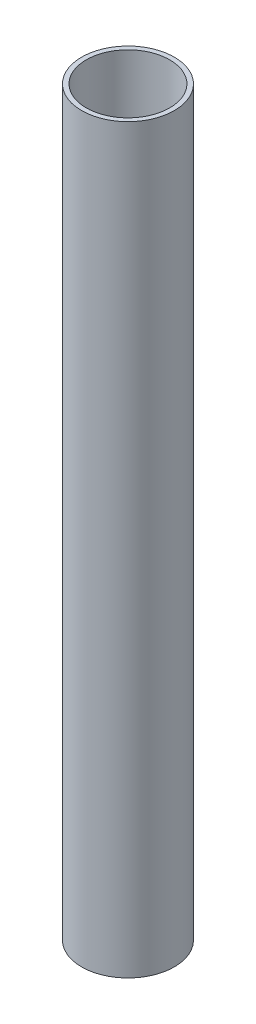
ISO-10303-21;
HEADER;
FILE_DESCRIPTION(('STEP AP214'),'2;1');
FILE_NAME('part.step','',(''),(''),'','','');
FILE_SCHEMA(('AUTOMOTIVE_DESIGN { 1 0 10303 214 1 1 1 1 }'));
ENDSEC;
DATA;
#1=APPLICATION_CONTEXT('core data for automotive mechanical design processes');
#2=APPLICATION_PROTOCOL_DEFINITION('international standard','automotive_design',2000,#1);
#3=PRODUCT_CONTEXT('',#1,'mechanical');
#4=PRODUCT('Part','Part','',(#3));
#5=PRODUCT_RELATED_PRODUCT_CATEGORY('part','',(#4));
#6=PRODUCT_DEFINITION_FORMATION('','',#4);
#7=PRODUCT_DEFINITION_CONTEXT('part definition',#1,'design');
#8=PRODUCT_DEFINITION('design','',#6,#7);
#9=PRODUCT_DEFINITION_SHAPE('','',#8);
#10=(LENGTH_UNIT() NAMED_UNIT(*) SI_UNIT(.MILLI.,.METRE.));
#11=(NAMED_UNIT(*) PLANE_ANGLE_UNIT() SI_UNIT($,.RADIAN.));
#12=(NAMED_UNIT(*) SI_UNIT($,.STERADIAN.) SOLID_ANGLE_UNIT());
#13=UNCERTAINTY_MEASURE_WITH_UNIT(LENGTH_MEASURE(1.E-05),#10,'distance_accuracy_value','');
#14=(GEOMETRIC_REPRESENTATION_CONTEXT(3) GLOBAL_UNCERTAINTY_ASSIGNED_CONTEXT((#13)) GLOBAL_UNIT_ASSIGNED_CONTEXT((#10,
#11,#12)) REPRESENTATION_CONTEXT('',''));
#15=CARTESIAN_POINT('',(0.,0.,0.));
#16=DIRECTION('',(0.,0.,1.));
#17=DIRECTION('',(1.,0.,0.));
#18=AXIS2_PLACEMENT_3D('',#15,#16,#17);
#19=CARTESIAN_POINT('',(0.,80.,0.));
#20=DIRECTION('',(0.,1.,0.));
#21=DIRECTION('',(0.,0.,1.));
#22=AXIS2_PLACEMENT_3D('',#19,#20,#21);
#23=PLANE('',#22);
#24=CARTESIAN_POINT('',(0.,80.,0.));
#25=DIRECTION('',(0.,1.,0.));
#26=DIRECTION('',(0.,0.,1.));
#27=AXIS2_PLACEMENT_3D('',#24,#25,#26);
#28=CIRCLE('',#27,10.);
#29=CARTESIAN_POINT('',(0.,80.,10.));
#30=VERTEX_POINT('',#29);
#31=EDGE_CURVE('E11',#30,#30,#28,.T.);
#32=ORIENTED_EDGE('',*,*,#31,.T.);
#33=EDGE_LOOP('',(#32));
#34=FACE_BOUND('',#33,.T.);
#35=CARTESIAN_POINT('',(0.,80.,0.));
#36=DIRECTION('',(0.,1.,0.));
#37=DIRECTION('',(1.,0.,0.));
#38=AXIS2_PLACEMENT_3D('',#35,#36,#37);
#39=CIRCLE('',#38,9.);
#40=CARTESIAN_POINT('',(9.,80.,0.));
#41=VERTEX_POINT('',#40);
#42=EDGE_CURVE('E50',#41,#41,#39,.T.);
#43=ORIENTED_EDGE('',*,*,#42,.F.);
#44=EDGE_LOOP('',(#43));
#45=FACE_BOUND('',#44,.T.);
#46=ADVANCED_FACE('F39',(#34,#45),#23,.T.);
#47=CARTESIAN_POINT('',(0.,-80.,0.));
#48=DIRECTION('',(0.,1.,0.));
#49=DIRECTION('',(0.,0.,1.));
#50=AXIS2_PLACEMENT_3D('',#47,#48,#49);
#51=PLANE('',#50);
#52=CARTESIAN_POINT('',(0.,-80.,0.));
#53=DIRECTION('',(0.,1.,0.));
#54=DIRECTION('',(0.,0.,1.));
#55=AXIS2_PLACEMENT_3D('',#52,#53,#54);
#56=CIRCLE('',#55,10.);
#57=CARTESIAN_POINT('',(0.,-80.,10.));
#58=VERTEX_POINT('',#57);
#59=EDGE_CURVE('E43',#58,#58,#56,.T.);
#60=ORIENTED_EDGE('',*,*,#59,.F.);
#61=EDGE_LOOP('',(#60));
#62=FACE_BOUND('',#61,.T.);
#63=CARTESIAN_POINT('',(0.,-80.,0.));
#64=DIRECTION('',(0.,1.,0.));
#65=DIRECTION('',(1.,0.,0.));
#66=AXIS2_PLACEMENT_3D('',#63,#64,#65);
#67=CIRCLE('',#66,9.);
#68=CARTESIAN_POINT('',(9.,-80.,0.));
#69=VERTEX_POINT('',#68);
#70=EDGE_CURVE('E52',#69,#69,#67,.T.);
#71=ORIENTED_EDGE('',*,*,#70,.T.);
#72=EDGE_LOOP('',(#71));
#73=FACE_BOUND('',#72,.T.);
#74=ADVANCED_FACE('F62',(#62,#73),#51,.F.);
#75=CARTESIAN_POINT('',(0.,80.,0.));
#76=DIRECTION('',(0.,-1.,0.));
#77=DIRECTION('',(0.,0.,-1.));
#78=AXIS2_PLACEMENT_3D('',#75,#76,#77);
#79=CYLINDRICAL_SURFACE('',#78,10.);
#80=ORIENTED_EDGE('',*,*,#31,.F.);
#81=EDGE_LOOP('',(#80));
#82=FACE_BOUND('',#81,.T.);
#83=ORIENTED_EDGE('',*,*,#59,.T.);
#84=EDGE_LOOP('',(#83));
#85=FACE_BOUND('',#84,.T.);
#86=ADVANCED_FACE('F41',(#82,#85),#79,.T.);
#87=CARTESIAN_POINT('',(0.,80.,0.));
#88=DIRECTION('',(0.,-1.,0.));
#89=DIRECTION('',(0.,0.,-1.));
#90=AXIS2_PLACEMENT_3D('',#87,#88,#89);
#91=CYLINDRICAL_SURFACE('',#90,9.);
#92=ORIENTED_EDGE('',*,*,#42,.T.);
#93=EDGE_LOOP('',(#92));
#94=FACE_BOUND('',#93,.T.);
#95=ORIENTED_EDGE('',*,*,#70,.F.);
#96=EDGE_LOOP('',(#95));
#97=FACE_BOUND('',#96,.T.);
#98=ADVANCED_FACE('F58',(#94,#97),#91,.F.);
#99=CLOSED_SHELL('',(#46,#74,#86,#98));
#100=MANIFOLD_SOLID_BREP('B2',#99);
#101=ADVANCED_BREP_SHAPE_REPRESENTATION('',(#18,#100),#14);
#102=SHAPE_DEFINITION_REPRESENTATION(#9,#101);
ENDSEC;
END-ISO-10303-21;
